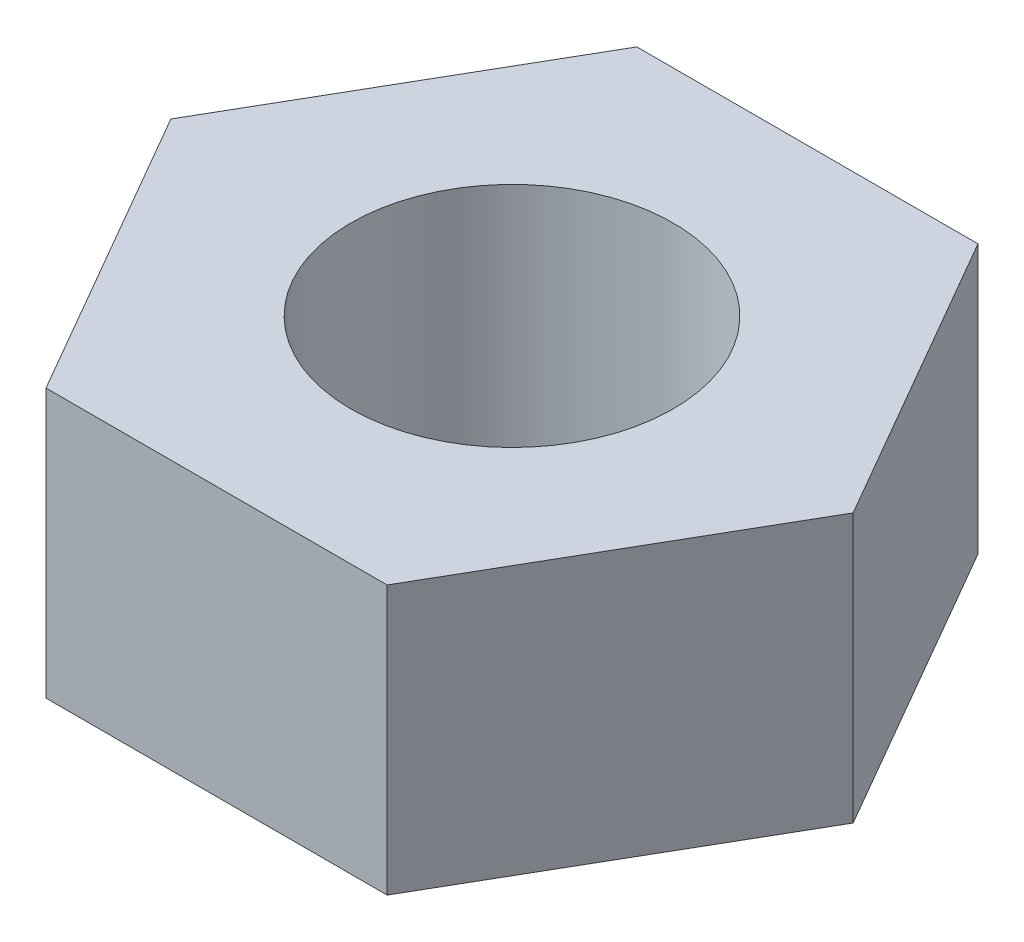
ISO-10303-21;
HEADER;
FILE_DESCRIPTION(('STEP AP214'),'2;1');
FILE_NAME('part.step','',(''),(''),'','','');
FILE_SCHEMA(('AUTOMOTIVE_DESIGN { 1 0 10303 214 1 1 1 1 }'));
ENDSEC;
DATA;
#1=APPLICATION_CONTEXT('core data for automotive mechanical design processes');
#2=APPLICATION_PROTOCOL_DEFINITION('international standard','automotive_design',2000,#1);
#3=PRODUCT_CONTEXT('',#1,'mechanical');
#4=PRODUCT('Part','Part','',(#3));
#5=PRODUCT_RELATED_PRODUCT_CATEGORY('part','',(#4));
#6=PRODUCT_DEFINITION_FORMATION('','',#4);
#7=PRODUCT_DEFINITION_CONTEXT('part definition',#1,'design');
#8=PRODUCT_DEFINITION('design','',#6,#7);
#9=PRODUCT_DEFINITION_SHAPE('','',#8);
#10=(LENGTH_UNIT() NAMED_UNIT(*) SI_UNIT(.MILLI.,.METRE.));
#11=(NAMED_UNIT(*) PLANE_ANGLE_UNIT() SI_UNIT($,.RADIAN.));
#12=(NAMED_UNIT(*) SI_UNIT($,.STERADIAN.) SOLID_ANGLE_UNIT());
#13=UNCERTAINTY_MEASURE_WITH_UNIT(LENGTH_MEASURE(1.E-05),#10,'distance_accuracy_value','');
#14=(GEOMETRIC_REPRESENTATION_CONTEXT(3) GLOBAL_UNCERTAINTY_ASSIGNED_CONTEXT((#13)) GLOBAL_UNIT_ASSIGNED_CONTEXT((#10,
#11,#12)) REPRESENTATION_CONTEXT('',''));
#15=CARTESIAN_POINT('',(0.,0.,0.));
#16=DIRECTION('',(0.,0.,1.));
#17=DIRECTION('',(1.,0.,0.));
#18=AXIS2_PLACEMENT_3D('',#15,#16,#17);
#19=CARTESIAN_POINT('',(0.,1.25,0.));
#20=DIRECTION('',(0.,1.,0.));
#21=DIRECTION('',(0.,0.,1.));
#22=AXIS2_PLACEMENT_3D('',#19,#20,#21);
#23=PLANE('',#22);
#24=DIRECTION('',(-0.5,0.,-0.866025403784438));
#25=VECTOR('',#24,1.);
#26=CARTESIAN_POINT('',(3.17542648054294,1.25,0.));
#27=LINE('',#26,#25);
#28=CARTESIAN_POINT('',(3.17542648054294,1.25,0.));
#29=VERTEX_POINT('',#28);
#30=CARTESIAN_POINT('',(1.58771324027147,1.25,-2.75));
#31=VERTEX_POINT('',#30);
#32=EDGE_CURVE('E146',#29,#31,#27,.T.);
#33=ORIENTED_EDGE('',*,*,#32,.T.);
#34=DIRECTION('',(-1.,0.,0.));
#35=VECTOR('',#34,1.);
#36=CARTESIAN_POINT('',(1.58771324027147,1.25,-2.75));
#37=LINE('',#36,#35);
#38=CARTESIAN_POINT('',(-1.58771324027147,1.25,-2.75));
#39=VERTEX_POINT('',#38);
#40=EDGE_CURVE('E94',#31,#39,#37,.T.);
#41=ORIENTED_EDGE('',*,*,#40,.T.);
#42=DIRECTION('',(-0.5,0.,0.866025403784439));
#43=VECTOR('',#42,1.);
#44=CARTESIAN_POINT('',(-1.58771324027147,1.25,-2.75));
#45=LINE('',#44,#43);
#46=CARTESIAN_POINT('',(-3.17542648054294,1.25,0.));
#47=VERTEX_POINT('',#46);
#48=EDGE_CURVE('E107',#39,#47,#45,.T.);
#49=ORIENTED_EDGE('',*,*,#48,.T.);
#50=DIRECTION('',(0.5,0.,0.866025403784438));
#51=VECTOR('',#50,1.);
#52=CARTESIAN_POINT('',(-3.17542648054294,1.25,0.));
#53=LINE('',#52,#51);
#54=CARTESIAN_POINT('',(-1.58771324027147,1.25,2.75));
#55=VERTEX_POINT('',#54);
#56=EDGE_CURVE('E101',#47,#55,#53,.T.);
#57=ORIENTED_EDGE('',*,*,#56,.T.);
#58=DIRECTION('',(1.,0.,0.));
#59=VECTOR('',#58,1.);
#60=CARTESIAN_POINT('',(-1.58771324027147,1.25,2.75));
#61=LINE('',#60,#59);
#62=CARTESIAN_POINT('',(1.58771324027147,1.25,2.75));
#63=VERTEX_POINT('',#62);
#64=EDGE_CURVE('E105',#55,#63,#61,.T.);
#65=ORIENTED_EDGE('',*,*,#64,.T.);
#66=DIRECTION('',(0.5,0.,-0.866025403784439));
#67=VECTOR('',#66,1.);
#68=CARTESIAN_POINT('',(1.58771324027147,1.25,2.75));
#69=LINE('',#68,#67);
#70=EDGE_CURVE('E57',#63,#29,#69,.T.);
#71=ORIENTED_EDGE('',*,*,#70,.T.);
#72=EDGE_LOOP('',(#33,#41,#49,#57,#65,#71));
#73=FACE_BOUND('',#72,.T.);
#74=CARTESIAN_POINT('',(0.,1.25,0.));
#75=DIRECTION('',(0.,1.,0.));
#76=DIRECTION('',(0.,0.,1.));
#77=AXIS2_PLACEMENT_3D('',#74,#75,#76);
#78=CIRCLE('',#77,1.5);
#79=CARTESIAN_POINT('',(0.,1.25,1.5));
#80=VERTEX_POINT('',#79);
#81=EDGE_CURVE('E134',#80,#80,#78,.T.);
#82=ORIENTED_EDGE('',*,*,#81,.F.);
#83=EDGE_LOOP('',(#82));
#84=FACE_BOUND('',#83,.T.);
#85=ADVANCED_FACE('F39',(#73,#84),#23,.T.);
#86=CARTESIAN_POINT('',(0.,-1.25,0.));
#87=DIRECTION('',(0.,1.,0.));
#88=DIRECTION('',(0.,0.,1.));
#89=AXIS2_PLACEMENT_3D('',#86,#87,#88);
#90=PLANE('',#89);
#91=DIRECTION('',(-0.5,0.,-0.866025403784438));
#92=VECTOR('',#91,1.);
#93=CARTESIAN_POINT('',(3.17542648054294,-1.25,0.));
#94=LINE('',#93,#92);
#95=CARTESIAN_POINT('',(3.17542648054294,-1.25,0.));
#96=VERTEX_POINT('',#95);
#97=CARTESIAN_POINT('',(1.58771324027147,-1.25,-2.75));
#98=VERTEX_POINT('',#97);
#99=EDGE_CURVE('E129',#96,#98,#94,.T.);
#100=ORIENTED_EDGE('',*,*,#99,.F.);
#101=DIRECTION('',(0.5,0.,-0.866025403784439));
#102=VECTOR('',#101,1.);
#103=CARTESIAN_POINT('',(1.58771324027147,-1.25,2.75));
#104=LINE('',#103,#102);
#105=CARTESIAN_POINT('',(1.58771324027147,-1.25,2.75));
#106=VERTEX_POINT('',#105);
#107=EDGE_CURVE('E86',#106,#96,#104,.T.);
#108=ORIENTED_EDGE('',*,*,#107,.F.);
#109=DIRECTION('',(1.,0.,0.));
#110=VECTOR('',#109,1.);
#111=CARTESIAN_POINT('',(-1.58771324027147,-1.25,2.75));
#112=LINE('',#111,#110);
#113=CARTESIAN_POINT('',(-1.58771324027147,-1.25,2.75));
#114=VERTEX_POINT('',#113);
#115=EDGE_CURVE('E80',#114,#106,#112,.T.);
#116=ORIENTED_EDGE('',*,*,#115,.F.);
#117=DIRECTION('',(0.5,0.,0.866025403784438));
#118=VECTOR('',#117,1.);
#119=CARTESIAN_POINT('',(-3.17542648054294,-1.25,0.));
#120=LINE('',#119,#118);
#121=CARTESIAN_POINT('',(-3.17542648054294,-1.25,0.));
#122=VERTEX_POINT('',#121);
#123=EDGE_CURVE('E116',#122,#114,#120,.T.);
#124=ORIENTED_EDGE('',*,*,#123,.F.);
#125=DIRECTION('',(-0.5,0.,0.866025403784439));
#126=VECTOR('',#125,1.);
#127=CARTESIAN_POINT('',(-1.58771324027147,-1.25,-2.75));
#128=LINE('',#127,#126);
#129=CARTESIAN_POINT('',(-1.58771324027147,-1.25,-2.75));
#130=VERTEX_POINT('',#129);
#131=EDGE_CURVE('E137',#130,#122,#128,.T.);
#132=ORIENTED_EDGE('',*,*,#131,.F.);
#133=DIRECTION('',(-1.,0.,0.));
#134=VECTOR('',#133,1.);
#135=CARTESIAN_POINT('',(1.58771324027147,-1.25,-2.75));
#136=LINE('',#135,#134);
#137=EDGE_CURVE('E133',#98,#130,#136,.T.);
#138=ORIENTED_EDGE('',*,*,#137,.F.);
#139=EDGE_LOOP('',(#100,#108,#116,#124,#132,#138));
#140=FACE_BOUND('',#139,.T.);
#141=CARTESIAN_POINT('',(0.,-1.25,0.));
#142=DIRECTION('',(0.,1.,0.));
#143=DIRECTION('',(0.,0.,1.));
#144=AXIS2_PLACEMENT_3D('',#141,#142,#143);
#145=CIRCLE('',#144,1.5);
#146=CARTESIAN_POINT('',(0.,-1.25,1.5));
#147=VERTEX_POINT('',#146);
#148=EDGE_CURVE('E243',#147,#147,#145,.T.);
#149=ORIENTED_EDGE('',*,*,#148,.T.);
#150=EDGE_LOOP('',(#149));
#151=FACE_BOUND('',#150,.T.);
#152=ADVANCED_FACE('F159',(#140,#151),#90,.F.);
#153=CARTESIAN_POINT('',(3.17542648054294,1.25,0.));
#154=DIRECTION('',(-0.866025403784439,0.,0.5));
#155=DIRECTION('',(0.5,0.,0.866025403784439));
#156=AXIS2_PLACEMENT_3D('',#153,#154,#155);
#157=PLANE('',#156);
#158=ORIENTED_EDGE('',*,*,#99,.T.);
#159=DIRECTION('',(0.,-1.,0.));
#160=VECTOR('',#159,1.);
#161=CARTESIAN_POINT('',(1.58771324027147,1.25,-2.75));
#162=LINE('',#161,#160);
#163=EDGE_CURVE('E11',#31,#98,#162,.T.);
#164=ORIENTED_EDGE('',*,*,#163,.F.);
#165=ORIENTED_EDGE('',*,*,#32,.F.);
#166=DIRECTION('',(0.,-1.,0.));
#167=VECTOR('',#166,1.);
#168=CARTESIAN_POINT('',(3.17542648054294,1.25,0.));
#169=LINE('',#168,#167);
#170=EDGE_CURVE('E125',#29,#96,#169,.T.);
#171=ORIENTED_EDGE('',*,*,#170,.T.);
#172=EDGE_LOOP('',(#158,#164,#165,#171));
#173=FACE_BOUND('',#172,.T.);
#174=ADVANCED_FACE('F41',(#173),#157,.F.);
#175=CARTESIAN_POINT('',(1.58771324027147,1.25,-2.75));
#176=DIRECTION('',(0.,0.,1.));
#177=DIRECTION('',(1.,0.,0.));
#178=AXIS2_PLACEMENT_3D('',#175,#176,#177);
#179=PLANE('',#178);
#180=ORIENTED_EDGE('',*,*,#137,.T.);
#181=DIRECTION('',(0.,-1.,0.));
#182=VECTOR('',#181,1.);
#183=CARTESIAN_POINT('',(-1.58771324027147,1.25,-2.75));
#184=LINE('',#183,#182);
#185=EDGE_CURVE('E49',#39,#130,#184,.T.);
#186=ORIENTED_EDGE('',*,*,#185,.F.);
#187=ORIENTED_EDGE('',*,*,#40,.F.);
#188=ORIENTED_EDGE('',*,*,#163,.T.);
#189=EDGE_LOOP('',(#180,#186,#187,#188));
#190=FACE_BOUND('',#189,.T.);
#191=ADVANCED_FACE('F184',(#190),#179,.F.);
#192=CARTESIAN_POINT('',(-1.58771324027147,1.25,-2.75));
#193=DIRECTION('',(0.866025403784439,0.,0.5));
#194=DIRECTION('',(0.5,0.,-0.866025403784439));
#195=AXIS2_PLACEMENT_3D('',#192,#193,#194);
#196=PLANE('',#195);
#197=ORIENTED_EDGE('',*,*,#131,.T.);
#198=DIRECTION('',(0.,-1.,0.));
#199=VECTOR('',#198,1.);
#200=CARTESIAN_POINT('',(-3.17542648054294,1.25,0.));
#201=LINE('',#200,#199);
#202=EDGE_CURVE('E118',#47,#122,#201,.T.);
#203=ORIENTED_EDGE('',*,*,#202,.F.);
#204=ORIENTED_EDGE('',*,*,#48,.F.);
#205=ORIENTED_EDGE('',*,*,#185,.T.);
#206=EDGE_LOOP('',(#197,#203,#204,#205));
#207=FACE_BOUND('',#206,.T.);
#208=ADVANCED_FACE('F156',(#207),#196,.F.);
#209=CARTESIAN_POINT('',(-3.17542648054294,1.25,0.));
#210=DIRECTION('',(0.866025403784439,0.,-0.5));
#211=DIRECTION('',(-0.5,0.,-0.866025403784439));
#212=AXIS2_PLACEMENT_3D('',#209,#210,#211);
#213=PLANE('',#212);
#214=ORIENTED_EDGE('',*,*,#123,.T.);
#215=DIRECTION('',(0.,-1.,0.));
#216=VECTOR('',#215,1.);
#217=CARTESIAN_POINT('',(-1.58771324027147,1.25,2.75));
#218=LINE('',#217,#216);
#219=EDGE_CURVE('E113',#55,#114,#218,.T.);
#220=ORIENTED_EDGE('',*,*,#219,.F.);
#221=ORIENTED_EDGE('',*,*,#56,.F.);
#222=ORIENTED_EDGE('',*,*,#202,.T.);
#223=EDGE_LOOP('',(#214,#220,#221,#222));
#224=FACE_BOUND('',#223,.T.);
#225=ADVANCED_FACE('F114',(#224),#213,.F.);
#226=CARTESIAN_POINT('',(-1.58771324027147,1.25,2.75));
#227=DIRECTION('',(0.,0.,-1.));
#228=DIRECTION('',(-1.,0.,0.));
#229=AXIS2_PLACEMENT_3D('',#226,#227,#228);
#230=PLANE('',#229);
#231=ORIENTED_EDGE('',*,*,#115,.T.);
#232=DIRECTION('',(0.,-1.,0.));
#233=VECTOR('',#232,1.);
#234=CARTESIAN_POINT('',(1.58771324027147,1.25,2.75));
#235=LINE('',#234,#233);
#236=EDGE_CURVE('E119',#63,#106,#235,.T.);
#237=ORIENTED_EDGE('',*,*,#236,.F.);
#238=ORIENTED_EDGE('',*,*,#64,.F.);
#239=ORIENTED_EDGE('',*,*,#219,.T.);
#240=EDGE_LOOP('',(#231,#237,#238,#239));
#241=FACE_BOUND('',#240,.T.);
#242=ADVANCED_FACE('F121',(#241),#230,.F.);
#243=CARTESIAN_POINT('',(1.58771324027147,1.25,2.75));
#244=DIRECTION('',(-0.866025403784439,0.,-0.5));
#245=DIRECTION('',(-0.5,0.,0.866025403784439));
#246=AXIS2_PLACEMENT_3D('',#243,#244,#245);
#247=PLANE('',#246);
#248=ORIENTED_EDGE('',*,*,#107,.T.);
#249=ORIENTED_EDGE('',*,*,#170,.F.);
#250=ORIENTED_EDGE('',*,*,#70,.F.);
#251=ORIENTED_EDGE('',*,*,#236,.T.);
#252=EDGE_LOOP('',(#248,#249,#250,#251));
#253=FACE_BOUND('',#252,.T.);
#254=ADVANCED_FACE('F164',(#253),#247,.F.);
#255=CARTESIAN_POINT('',(0.,1.25,0.));
#256=DIRECTION('',(0.,-1.,0.));
#257=DIRECTION('',(0.,0.,-1.));
#258=AXIS2_PLACEMENT_3D('',#255,#256,#257);
#259=CYLINDRICAL_SURFACE('',#258,1.5);
#260=ORIENTED_EDGE('',*,*,#81,.T.);
#261=EDGE_LOOP('',(#260));
#262=FACE_BOUND('',#261,.T.);
#263=ORIENTED_EDGE('',*,*,#148,.F.);
#264=EDGE_LOOP('',(#263));
#265=FACE_BOUND('',#264,.T.);
#266=ADVANCED_FACE('F166',(#262,#265),#259,.F.);
#267=CLOSED_SHELL('',(#85,#152,#174,#191,#208,#225,#242,#254,#266));
#268=MANIFOLD_SOLID_BREP('B2',#267);
#269=ADVANCED_BREP_SHAPE_REPRESENTATION('',(#18,#268),#14);
#270=SHAPE_DEFINITION_REPRESENTATION(#9,#269);
ENDSEC;
END-ISO-10303-21;
